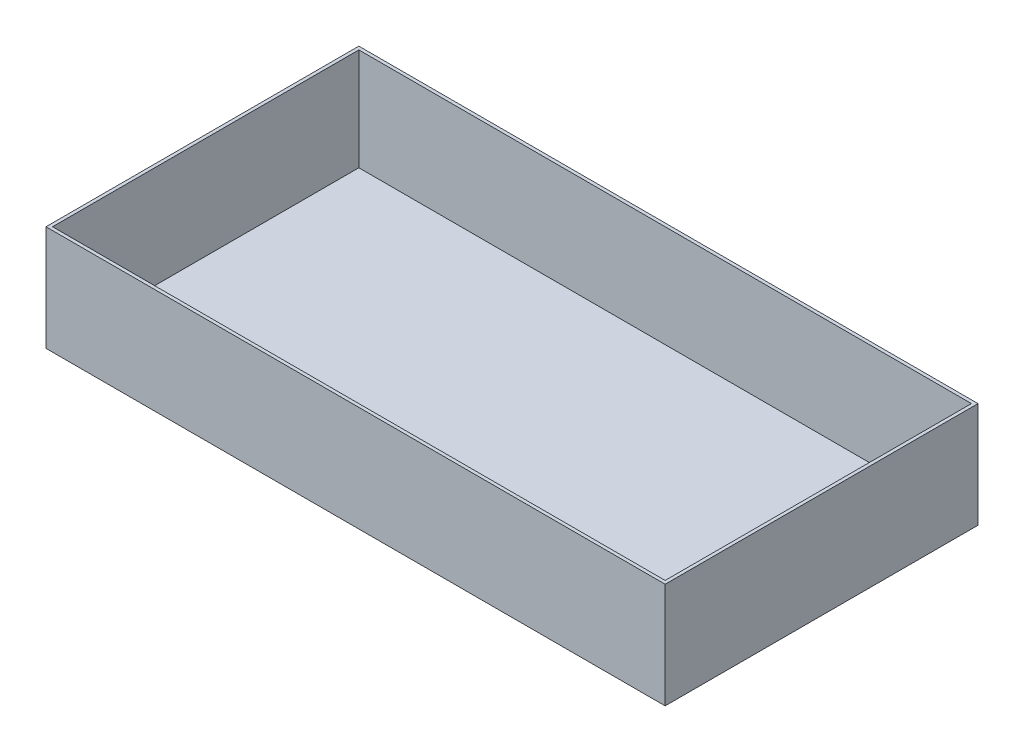
ISO-10303-21;
HEADER;
FILE_DESCRIPTION(('STEP AP214'),'2;1');
FILE_NAME('part.step','',(''),(''),'','','');
FILE_SCHEMA(('AUTOMOTIVE_DESIGN { 1 0 10303 214 1 1 1 1 }'));
ENDSEC;
DATA;
#1=APPLICATION_CONTEXT('core data for automotive mechanical design processes');
#2=APPLICATION_PROTOCOL_DEFINITION('international standard','automotive_design',2000,#1);
#3=PRODUCT_CONTEXT('',#1,'mechanical');
#4=PRODUCT('Part','Part','',(#3));
#5=PRODUCT_RELATED_PRODUCT_CATEGORY('part','',(#4));
#6=PRODUCT_DEFINITION_FORMATION('','',#4);
#7=PRODUCT_DEFINITION_CONTEXT('part definition',#1,'design');
#8=PRODUCT_DEFINITION('design','',#6,#7);
#9=PRODUCT_DEFINITION_SHAPE('','',#8);
#10=(LENGTH_UNIT() NAMED_UNIT(*) SI_UNIT(.MILLI.,.METRE.));
#11=(NAMED_UNIT(*) PLANE_ANGLE_UNIT() SI_UNIT($,.RADIAN.));
#12=(NAMED_UNIT(*) SI_UNIT($,.STERADIAN.) SOLID_ANGLE_UNIT());
#13=UNCERTAINTY_MEASURE_WITH_UNIT(LENGTH_MEASURE(1.E-05),#10,'distance_accuracy_value','');
#14=(GEOMETRIC_REPRESENTATION_CONTEXT(3) GLOBAL_UNCERTAINTY_ASSIGNED_CONTEXT((#13)) GLOBAL_UNIT_ASSIGNED_CONTEXT((#10,
#11,#12)) REPRESENTATION_CONTEXT('',''));
#15=CARTESIAN_POINT('',(0.,0.,0.));
#16=DIRECTION('',(0.,0.,1.));
#17=DIRECTION('',(1.,0.,0.));
#18=AXIS2_PLACEMENT_3D('',#15,#16,#17);
#19=CARTESIAN_POINT('',(0.,25.4,-76.2));
#20=DIRECTION('',(0.,-1.,0.));
#21=DIRECTION('',(0.,0.,-1.));
#22=AXIS2_PLACEMENT_3D('',#19,#20,#21);
#23=PLANE('',#22);
#24=DIRECTION('',(0.,0.,1.));
#25=VECTOR('',#24,1.);
#26=CARTESIAN_POINT('',(-0.8128,25.4,-76.2));
#27=LINE('',#26,#25);
#28=CARTESIAN_POINT('',(-0.8128,25.4,-77.0128));
#29=VERTEX_POINT('',#28);
#30=CARTESIAN_POINT('',(-0.8128,25.4,0.8128));
#31=VERTEX_POINT('',#30);
#32=EDGE_CURVE('E154',#29,#31,#27,.T.);
#33=ORIENTED_EDGE('',*,*,#32,.T.);
#34=DIRECTION('',(1.,0.,0.));
#35=VECTOR('',#34,1.);
#36=CARTESIAN_POINT('',(0.,25.4,0.812800000000002));
#37=LINE('',#36,#35);
#38=CARTESIAN_POINT('',(153.2128,25.4,0.8128));
#39=VERTEX_POINT('',#38);
#40=EDGE_CURVE('E156',#31,#39,#37,.T.);
#41=ORIENTED_EDGE('',*,*,#40,.T.);
#42=DIRECTION('',(0.,0.,-1.));
#43=VECTOR('',#42,1.);
#44=CARTESIAN_POINT('',(153.2128,25.4,-76.2));
#45=LINE('',#44,#43);
#46=CARTESIAN_POINT('',(153.2128,25.4,-77.0128));
#47=VERTEX_POINT('',#46);
#48=EDGE_CURVE('E157',#39,#47,#45,.T.);
#49=ORIENTED_EDGE('',*,*,#48,.T.);
#50=DIRECTION('',(-1.,0.,0.));
#51=VECTOR('',#50,1.);
#52=CARTESIAN_POINT('',(0.,25.4,-77.0128));
#53=LINE('',#52,#51);
#54=EDGE_CURVE('E35',#47,#29,#53,.T.);
#55=ORIENTED_EDGE('',*,*,#54,.T.);
#56=EDGE_LOOP('',(#33,#41,#49,#55));
#57=FACE_BOUND('',#56,.T.);
#58=DIRECTION('',(0.,0.,1.));
#59=VECTOR('',#58,1.);
#60=CARTESIAN_POINT('',(0.,25.4,0.));
#61=LINE('',#60,#59);
#62=CARTESIAN_POINT('',(0.,25.4,-76.2));
#63=VERTEX_POINT('',#62);
#64=CARTESIAN_POINT('',(0.,25.4,0.));
#65=VERTEX_POINT('',#64);
#66=EDGE_CURVE('E100',#63,#65,#61,.T.);
#67=ORIENTED_EDGE('',*,*,#66,.F.);
#68=DIRECTION('',(-1.,0.,0.));
#69=VECTOR('',#68,1.);
#70=CARTESIAN_POINT('',(0.,25.4,-76.2));
#71=LINE('',#70,#69);
#72=CARTESIAN_POINT('',(152.4,25.4,-76.2));
#73=VERTEX_POINT('',#72);
#74=EDGE_CURVE('E125',#73,#63,#71,.T.);
#75=ORIENTED_EDGE('',*,*,#74,.F.);
#76=DIRECTION('',(0.,0.,-1.));
#77=VECTOR('',#76,1.);
#78=CARTESIAN_POINT('',(152.4,25.4,0.));
#79=LINE('',#78,#77);
#80=CARTESIAN_POINT('',(152.4,25.4,0.));
#81=VERTEX_POINT('',#80);
#82=EDGE_CURVE('E123',#81,#73,#79,.T.);
#83=ORIENTED_EDGE('',*,*,#82,.F.);
#84=DIRECTION('',(1.,0.,0.));
#85=VECTOR('',#84,1.);
#86=CARTESIAN_POINT('',(0.,25.4,0.));
#87=LINE('',#86,#85);
#88=EDGE_CURVE('E111',#65,#81,#87,.T.);
#89=ORIENTED_EDGE('',*,*,#88,.F.);
#90=EDGE_LOOP('',(#67,#75,#83,#89));
#91=FACE_BOUND('',#90,.T.);
#92=ADVANCED_FACE('F31',(#57,#91),#23,.F.);
#93=CARTESIAN_POINT('',(-0.8128,25.4,0.));
#94=DIRECTION('',(1.,0.,0.));
#95=DIRECTION('',(0.,0.,-1.));
#96=AXIS2_PLACEMENT_3D('',#93,#94,#95);
#97=PLANE('',#96);
#98=DIRECTION('',(0.,0.,1.));
#99=VECTOR('',#98,1.);
#100=CARTESIAN_POINT('',(-0.8128,-0.8128,-76.2));
#101=LINE('',#100,#99);
#102=CARTESIAN_POINT('',(-0.8128,-0.8128,-77.0128));
#103=VERTEX_POINT('',#102);
#104=CARTESIAN_POINT('',(-0.8128,-0.8128,0.8128));
#105=VERTEX_POINT('',#104);
#106=EDGE_CURVE('E119',#103,#105,#101,.T.);
#107=ORIENTED_EDGE('',*,*,#106,.T.);
#108=DIRECTION('',(0.,-1.,0.));
#109=VECTOR('',#108,1.);
#110=CARTESIAN_POINT('',(-0.8128,25.4,0.8128));
#111=LINE('',#110,#109);
#112=EDGE_CURVE('E11',#31,#105,#111,.T.);
#113=ORIENTED_EDGE('',*,*,#112,.F.);
#114=ORIENTED_EDGE('',*,*,#32,.F.);
#115=DIRECTION('',(0.,-1.,0.));
#116=VECTOR('',#115,1.);
#117=CARTESIAN_POINT('',(-0.8128,25.4,-77.0128));
#118=LINE('',#117,#116);
#119=EDGE_CURVE('E141',#29,#103,#118,.T.);
#120=ORIENTED_EDGE('',*,*,#119,.T.);
#121=EDGE_LOOP('',(#107,#113,#114,#120));
#122=FACE_BOUND('',#121,.T.);
#123=ADVANCED_FACE('F171',(#122),#97,.F.);
#124=CARTESIAN_POINT('',(0.,25.4,0.8128));
#125=DIRECTION('',(0.,0.,-1.));
#126=DIRECTION('',(-1.,0.,0.));
#127=AXIS2_PLACEMENT_3D('',#124,#125,#126);
#128=PLANE('',#127);
#129=DIRECTION('',(1.,0.,0.));
#130=VECTOR('',#129,1.);
#131=CARTESIAN_POINT('',(0.,-0.8128,0.812800000000002));
#132=LINE('',#131,#130);
#133=CARTESIAN_POINT('',(153.2128,-0.8128,0.8128));
#134=VERTEX_POINT('',#133);
#135=EDGE_CURVE('E139',#105,#134,#132,.T.);
#136=ORIENTED_EDGE('',*,*,#135,.T.);
#137=DIRECTION('',(0.,-1.,0.));
#138=VECTOR('',#137,1.);
#139=CARTESIAN_POINT('',(153.2128,25.4,0.8128));
#140=LINE('',#139,#138);
#141=EDGE_CURVE('E40',#39,#134,#140,.T.);
#142=ORIENTED_EDGE('',*,*,#141,.F.);
#143=ORIENTED_EDGE('',*,*,#40,.F.);
#144=ORIENTED_EDGE('',*,*,#112,.T.);
#145=EDGE_LOOP('',(#136,#142,#143,#144));
#146=FACE_BOUND('',#145,.T.);
#147=ADVANCED_FACE('F173',(#146),#128,.F.);
#148=CARTESIAN_POINT('',(153.2128,25.4,0.));
#149=DIRECTION('',(-1.,0.,0.));
#150=DIRECTION('',(0.,0.,1.));
#151=AXIS2_PLACEMENT_3D('',#148,#149,#150);
#152=PLANE('',#151);
#153=DIRECTION('',(0.,0.,-1.));
#154=VECTOR('',#153,1.);
#155=CARTESIAN_POINT('',(153.2128,-0.8128,-76.2));
#156=LINE('',#155,#154);
#157=CARTESIAN_POINT('',(153.2128,-0.8128,-77.0128));
#158=VERTEX_POINT('',#157);
#159=EDGE_CURVE('E146',#134,#158,#156,.T.);
#160=ORIENTED_EDGE('',*,*,#159,.T.);
#161=DIRECTION('',(0.,-1.,0.));
#162=VECTOR('',#161,1.);
#163=CARTESIAN_POINT('',(153.2128,25.4,-77.0128));
#164=LINE('',#163,#162);
#165=EDGE_CURVE('E144',#47,#158,#164,.T.);
#166=ORIENTED_EDGE('',*,*,#165,.F.);
#167=ORIENTED_EDGE('',*,*,#48,.F.);
#168=ORIENTED_EDGE('',*,*,#141,.T.);
#169=EDGE_LOOP('',(#160,#166,#167,#168));
#170=FACE_BOUND('',#169,.T.);
#171=ADVANCED_FACE('F162',(#170),#152,.F.);
#172=CARTESIAN_POINT('',(0.,25.4,-77.0128));
#173=DIRECTION('',(0.,0.,1.));
#174=DIRECTION('',(1.,0.,0.));
#175=AXIS2_PLACEMENT_3D('',#172,#173,#174);
#176=PLANE('',#175);
#177=DIRECTION('',(-1.,0.,0.));
#178=VECTOR('',#177,1.);
#179=CARTESIAN_POINT('',(0.,-0.8128,-77.0128));
#180=LINE('',#179,#178);
#181=EDGE_CURVE('E150',#158,#103,#180,.T.);
#182=ORIENTED_EDGE('',*,*,#181,.T.);
#183=ORIENTED_EDGE('',*,*,#119,.F.);
#184=ORIENTED_EDGE('',*,*,#54,.F.);
#185=ORIENTED_EDGE('',*,*,#165,.T.);
#186=EDGE_LOOP('',(#182,#183,#184,#185));
#187=FACE_BOUND('',#186,.T.);
#188=ADVANCED_FACE('F166',(#187),#176,.F.);
#189=CARTESIAN_POINT('',(0.,-0.8128,-76.2));
#190=DIRECTION('',(0.,-1.,0.));
#191=DIRECTION('',(0.,0.,-1.));
#192=AXIS2_PLACEMENT_3D('',#189,#190,#191);
#193=PLANE('',#192);
#194=ORIENTED_EDGE('',*,*,#106,.F.);
#195=ORIENTED_EDGE('',*,*,#181,.F.);
#196=ORIENTED_EDGE('',*,*,#159,.F.);
#197=ORIENTED_EDGE('',*,*,#135,.F.);
#198=EDGE_LOOP('',(#194,#195,#196,#197));
#199=FACE_BOUND('',#198,.T.);
#200=ADVANCED_FACE('F33',(#199),#193,.T.);
#201=CARTESIAN_POINT('',(0.,25.4,0.));
#202=DIRECTION('',(1.,0.,0.));
#203=DIRECTION('',(0.,0.,-1.));
#204=AXIS2_PLACEMENT_3D('',#201,#202,#203);
#205=PLANE('',#204);
#206=DIRECTION('',(0.,0.,1.));
#207=VECTOR('',#206,1.);
#208=CARTESIAN_POINT('',(0.,0.,0.));
#209=LINE('',#208,#207);
#210=CARTESIAN_POINT('',(0.,0.,-76.2));
#211=VERTEX_POINT('',#210);
#212=CARTESIAN_POINT('',(0.,0.,0.));
#213=VERTEX_POINT('',#212);
#214=EDGE_CURVE('E129',#211,#213,#209,.T.);
#215=ORIENTED_EDGE('',*,*,#214,.F.);
#216=DIRECTION('',(0.,-1.,0.));
#217=VECTOR('',#216,1.);
#218=CARTESIAN_POINT('',(0.,25.4,-76.2));
#219=LINE('',#218,#217);
#220=EDGE_CURVE('E107',#63,#211,#219,.T.);
#221=ORIENTED_EDGE('',*,*,#220,.F.);
#222=ORIENTED_EDGE('',*,*,#66,.T.);
#223=DIRECTION('',(0.,-1.,0.));
#224=VECTOR('',#223,1.);
#225=CARTESIAN_POINT('',(0.,25.4,0.));
#226=LINE('',#225,#224);
#227=EDGE_CURVE('E104',#65,#213,#226,.T.);
#228=ORIENTED_EDGE('',*,*,#227,.T.);
#229=EDGE_LOOP('',(#215,#221,#222,#228));
#230=FACE_BOUND('',#229,.T.);
#231=ADVANCED_FACE('F103',(#230),#205,.T.);
#232=CARTESIAN_POINT('',(0.,25.4,0.));
#233=DIRECTION('',(0.,0.,-1.));
#234=DIRECTION('',(-1.,0.,0.));
#235=AXIS2_PLACEMENT_3D('',#232,#233,#234);
#236=PLANE('',#235);
#237=DIRECTION('',(1.,0.,0.));
#238=VECTOR('',#237,1.);
#239=CARTESIAN_POINT('',(0.,0.,0.));
#240=LINE('',#239,#238);
#241=CARTESIAN_POINT('',(152.4,0.,0.));
#242=VERTEX_POINT('',#241);
#243=EDGE_CURVE('E118',#213,#242,#240,.T.);
#244=ORIENTED_EDGE('',*,*,#243,.F.);
#245=ORIENTED_EDGE('',*,*,#227,.F.);
#246=ORIENTED_EDGE('',*,*,#88,.T.);
#247=DIRECTION('',(0.,-1.,0.));
#248=VECTOR('',#247,1.);
#249=CARTESIAN_POINT('',(152.4,25.4,0.));
#250=LINE('',#249,#248);
#251=EDGE_CURVE('E120',#81,#242,#250,.T.);
#252=ORIENTED_EDGE('',*,*,#251,.T.);
#253=EDGE_LOOP('',(#244,#245,#246,#252));
#254=FACE_BOUND('',#253,.T.);
#255=ADVANCED_FACE('F115',(#254),#236,.T.);
#256=CARTESIAN_POINT('',(152.4,25.4,0.));
#257=DIRECTION('',(-1.,0.,0.));
#258=DIRECTION('',(0.,0.,1.));
#259=AXIS2_PLACEMENT_3D('',#256,#257,#258);
#260=PLANE('',#259);
#261=DIRECTION('',(0.,0.,-1.));
#262=VECTOR('',#261,1.);
#263=CARTESIAN_POINT('',(152.4,0.,0.));
#264=LINE('',#263,#262);
#265=CARTESIAN_POINT('',(152.4,0.,-76.2));
#266=VERTEX_POINT('',#265);
#267=EDGE_CURVE('E132',#242,#266,#264,.T.);
#268=ORIENTED_EDGE('',*,*,#267,.F.);
#269=ORIENTED_EDGE('',*,*,#251,.F.);
#270=ORIENTED_EDGE('',*,*,#82,.T.);
#271=DIRECTION('',(0.,-1.,0.));
#272=VECTOR('',#271,1.);
#273=CARTESIAN_POINT('',(152.4,25.4,-76.2));
#274=LINE('',#273,#272);
#275=EDGE_CURVE('E48',#73,#266,#274,.T.);
#276=ORIENTED_EDGE('',*,*,#275,.T.);
#277=EDGE_LOOP('',(#268,#269,#270,#276));
#278=FACE_BOUND('',#277,.T.);
#279=ADVANCED_FACE('F220',(#278),#260,.T.);
#280=CARTESIAN_POINT('',(0.,25.4,-76.2));
#281=DIRECTION('',(0.,0.,1.));
#282=DIRECTION('',(1.,0.,0.));
#283=AXIS2_PLACEMENT_3D('',#280,#281,#282);
#284=PLANE('',#283);
#285=DIRECTION('',(-1.,0.,0.));
#286=VECTOR('',#285,1.);
#287=CARTESIAN_POINT('',(0.,0.,-76.2));
#288=LINE('',#287,#286);
#289=EDGE_CURVE('E112',#266,#211,#288,.T.);
#290=ORIENTED_EDGE('',*,*,#289,.F.);
#291=ORIENTED_EDGE('',*,*,#275,.F.);
#292=ORIENTED_EDGE('',*,*,#74,.T.);
#293=ORIENTED_EDGE('',*,*,#220,.T.);
#294=EDGE_LOOP('',(#290,#291,#292,#293));
#295=FACE_BOUND('',#294,.T.);
#296=ADVANCED_FACE('F228',(#295),#284,.T.);
#297=CARTESIAN_POINT('',(0.,0.,-76.2));
#298=DIRECTION('',(0.,-1.,0.));
#299=DIRECTION('',(0.,0.,-1.));
#300=AXIS2_PLACEMENT_3D('',#297,#298,#299);
#301=PLANE('',#300);
#302=ORIENTED_EDGE('',*,*,#214,.T.);
#303=ORIENTED_EDGE('',*,*,#243,.T.);
#304=ORIENTED_EDGE('',*,*,#267,.T.);
#305=ORIENTED_EDGE('',*,*,#289,.T.);
#306=EDGE_LOOP('',(#302,#303,#304,#305));
#307=FACE_BOUND('',#306,.T.);
#308=ADVANCED_FACE('F238',(#307),#301,.F.);
#309=CLOSED_SHELL('',(#92,#123,#147,#171,#188,#200,#231,#255,#279,#296,#308));
#310=MANIFOLD_SOLID_BREP('B2',#309);
#311=ADVANCED_BREP_SHAPE_REPRESENTATION('',(#18,#310),#14);
#312=SHAPE_DEFINITION_REPRESENTATION(#9,#311);
ENDSEC;
END-ISO-10303-21;
